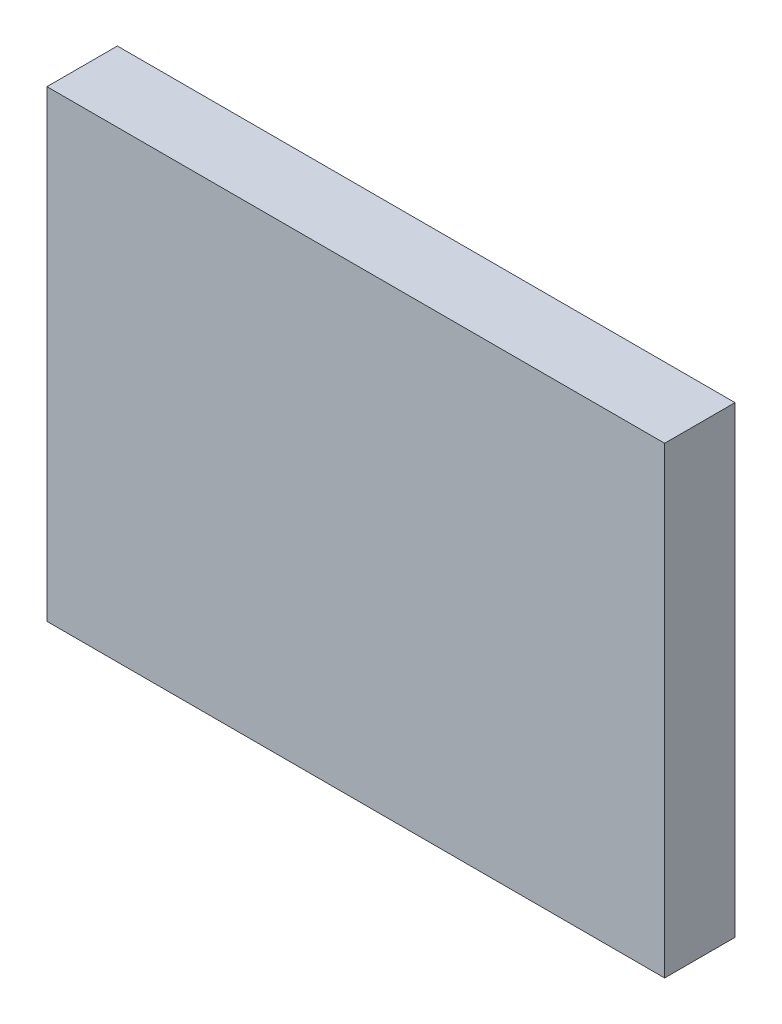
ISO-10303-21;
HEADER;
FILE_DESCRIPTION(('STEP AP214'),'2;1');
FILE_NAME('part.step','',(''),(''),'','','');
FILE_SCHEMA(('AUTOMOTIVE_DESIGN { 1 0 10303 214 1 1 1 1 }'));
ENDSEC;
DATA;
#1=APPLICATION_CONTEXT('core data for automotive mechanical design processes');
#2=APPLICATION_PROTOCOL_DEFINITION('international standard','automotive_design',2000,#1);
#3=PRODUCT_CONTEXT('',#1,'mechanical');
#4=PRODUCT('Part','Part','',(#3));
#5=PRODUCT_RELATED_PRODUCT_CATEGORY('part','',(#4));
#6=PRODUCT_DEFINITION_FORMATION('','',#4);
#7=PRODUCT_DEFINITION_CONTEXT('part definition',#1,'design');
#8=PRODUCT_DEFINITION('design','',#6,#7);
#9=PRODUCT_DEFINITION_SHAPE('','',#8);
#10=(LENGTH_UNIT() NAMED_UNIT(*) SI_UNIT(.MILLI.,.METRE.));
#11=(NAMED_UNIT(*) PLANE_ANGLE_UNIT() SI_UNIT($,.RADIAN.));
#12=(NAMED_UNIT(*) SI_UNIT($,.STERADIAN.) SOLID_ANGLE_UNIT());
#13=UNCERTAINTY_MEASURE_WITH_UNIT(LENGTH_MEASURE(1.E-05),#10,'distance_accuracy_value','');
#14=(GEOMETRIC_REPRESENTATION_CONTEXT(3) GLOBAL_UNCERTAINTY_ASSIGNED_CONTEXT((#13)) GLOBAL_UNIT_ASSIGNED_CONTEXT((#10,
#11,#12)) REPRESENTATION_CONTEXT('',''));
#15=CARTESIAN_POINT('',(0.,0.,0.));
#16=DIRECTION('',(0.,0.,1.));
#17=DIRECTION('',(1.,0.,0.));
#18=AXIS2_PLACEMENT_3D('',#15,#16,#17);
#19=CARTESIAN_POINT('',(0.,2999.,0.));
#20=DIRECTION('',(1.,0.,0.));
#21=DIRECTION('',(0.,0.,-1.));
#22=AXIS2_PLACEMENT_3D('',#19,#20,#21);
#23=PLANE('',#22);
#24=DIRECTION('',(0.,0.,1.));
#25=VECTOR('',#24,1.);
#26=CARTESIAN_POINT('',(0.,0.,0.));
#27=LINE('',#26,#25);
#28=CARTESIAN_POINT('',(0.,0.,-455.932560115936));
#29=VERTEX_POINT('',#28);
#30=CARTESIAN_POINT('',(0.,0.,0.));
#31=VERTEX_POINT('',#30);
#32=EDGE_CURVE('E96',#29,#31,#27,.T.);
#33=ORIENTED_EDGE('',*,*,#32,.T.);
#34=DIRECTION('',(0.,-1.,0.));
#35=VECTOR('',#34,1.);
#36=CARTESIAN_POINT('',(0.,2999.,0.));
#37=LINE('',#36,#35);
#38=CARTESIAN_POINT('',(0.,2999.,0.));
#39=VERTEX_POINT('',#38);
#40=EDGE_CURVE('E11',#39,#31,#37,.T.);
#41=ORIENTED_EDGE('',*,*,#40,.F.);
#42=DIRECTION('',(0.,0.,1.));
#43=VECTOR('',#42,1.);
#44=CARTESIAN_POINT('',(0.,2999.,0.));
#45=LINE('',#44,#43);
#46=CARTESIAN_POINT('',(0.,2999.,-455.932560115936));
#47=VERTEX_POINT('',#46);
#48=EDGE_CURVE('E84',#47,#39,#45,.T.);
#49=ORIENTED_EDGE('',*,*,#48,.F.);
#50=DIRECTION('',(0.,-1.,0.));
#51=VECTOR('',#50,1.);
#52=CARTESIAN_POINT('',(0.,2999.,-455.932560115936));
#53=LINE('',#52,#51);
#54=EDGE_CURVE('E92',#47,#29,#53,.T.);
#55=ORIENTED_EDGE('',*,*,#54,.T.);
#56=EDGE_LOOP('',(#33,#41,#49,#55));
#57=FACE_BOUND('',#56,.T.);
#58=ADVANCED_FACE('F33',(#57),#23,.F.);
#59=CARTESIAN_POINT('',(0.,2999.,0.));
#60=DIRECTION('',(0.,0.,-1.));
#61=DIRECTION('',(-1.,0.,0.));
#62=AXIS2_PLACEMENT_3D('',#59,#60,#61);
#63=PLANE('',#62);
#64=DIRECTION('',(1.,0.,0.));
#65=VECTOR('',#64,1.);
#66=CARTESIAN_POINT('',(0.,0.,0.));
#67=LINE('',#66,#65);
#68=CARTESIAN_POINT('',(4000.,0.,0.));
#69=VERTEX_POINT('',#68);
#70=EDGE_CURVE('E88',#31,#69,#67,.T.);
#71=ORIENTED_EDGE('',*,*,#70,.T.);
#72=DIRECTION('',(0.,-1.,0.));
#73=VECTOR('',#72,1.);
#74=CARTESIAN_POINT('',(4000.,2999.,0.));
#75=LINE('',#74,#73);
#76=CARTESIAN_POINT('',(4000.,2999.,0.));
#77=VERTEX_POINT('',#76);
#78=EDGE_CURVE('E41',#77,#69,#75,.T.);
#79=ORIENTED_EDGE('',*,*,#78,.F.);
#80=DIRECTION('',(1.,0.,0.));
#81=VECTOR('',#80,1.);
#82=CARTESIAN_POINT('',(0.,2999.,0.));
#83=LINE('',#82,#81);
#84=EDGE_CURVE('E79',#39,#77,#83,.T.);
#85=ORIENTED_EDGE('',*,*,#84,.F.);
#86=ORIENTED_EDGE('',*,*,#40,.T.);
#87=EDGE_LOOP('',(#71,#79,#85,#86));
#88=FACE_BOUND('',#87,.T.);
#89=ADVANCED_FACE('F87',(#88),#63,.F.);
#90=CARTESIAN_POINT('',(4000.,2999.,0.));
#91=DIRECTION('',(-1.,0.,0.));
#92=DIRECTION('',(0.,0.,1.));
#93=AXIS2_PLACEMENT_3D('',#90,#91,#92);
#94=PLANE('',#93);
#95=DIRECTION('',(0.,0.,-1.));
#96=VECTOR('',#95,1.);
#97=CARTESIAN_POINT('',(4000.,0.,0.));
#98=LINE('',#97,#96);
#99=CARTESIAN_POINT('',(4000.,0.,-455.932560115936));
#100=VERTEX_POINT('',#99);
#101=EDGE_CURVE('E66',#69,#100,#98,.T.);
#102=ORIENTED_EDGE('',*,*,#101,.T.);
#103=DIRECTION('',(0.,-1.,0.));
#104=VECTOR('',#103,1.);
#105=CARTESIAN_POINT('',(4000.,2999.,-455.932560115936));
#106=LINE('',#105,#104);
#107=CARTESIAN_POINT('',(4000.,2999.,-455.932560115936));
#108=VERTEX_POINT('',#107);
#109=EDGE_CURVE('E89',#108,#100,#106,.T.);
#110=ORIENTED_EDGE('',*,*,#109,.F.);
#111=DIRECTION('',(0.,0.,-1.));
#112=VECTOR('',#111,1.);
#113=CARTESIAN_POINT('',(4000.,2999.,0.));
#114=LINE('',#113,#112);
#115=EDGE_CURVE('E82',#77,#108,#114,.T.);
#116=ORIENTED_EDGE('',*,*,#115,.F.);
#117=ORIENTED_EDGE('',*,*,#78,.T.);
#118=EDGE_LOOP('',(#102,#110,#116,#117));
#119=FACE_BOUND('',#118,.T.);
#120=ADVANCED_FACE('F90',(#119),#94,.F.);
#121=CARTESIAN_POINT('',(0.,2999.,-455.932560115936));
#122=DIRECTION('',(0.,0.,1.));
#123=DIRECTION('',(1.,0.,0.));
#124=AXIS2_PLACEMENT_3D('',#121,#122,#123);
#125=PLANE('',#124);
#126=DIRECTION('',(-1.,0.,0.));
#127=VECTOR('',#126,1.);
#128=CARTESIAN_POINT('',(0.,0.,-455.932560115936));
#129=LINE('',#128,#127);
#130=EDGE_CURVE('E72',#100,#29,#129,.T.);
#131=ORIENTED_EDGE('',*,*,#130,.T.);
#132=ORIENTED_EDGE('',*,*,#54,.F.);
#133=DIRECTION('',(-1.,0.,0.));
#134=VECTOR('',#133,1.);
#135=CARTESIAN_POINT('',(0.,2999.,-455.932560115936));
#136=LINE('',#135,#134);
#137=EDGE_CURVE('E49',#108,#47,#136,.T.);
#138=ORIENTED_EDGE('',*,*,#137,.F.);
#139=ORIENTED_EDGE('',*,*,#109,.T.);
#140=EDGE_LOOP('',(#131,#132,#138,#139));
#141=FACE_BOUND('',#140,.T.);
#142=ADVANCED_FACE('F103',(#141),#125,.F.);
#143=CARTESIAN_POINT('',(0.,2999.,0.));
#144=DIRECTION('',(0.,-1.,0.));
#145=DIRECTION('',(0.,0.,-1.));
#146=AXIS2_PLACEMENT_3D('',#143,#144,#145);
#147=PLANE('',#146);
#148=ORIENTED_EDGE('',*,*,#48,.T.);
#149=ORIENTED_EDGE('',*,*,#84,.T.);
#150=ORIENTED_EDGE('',*,*,#115,.T.);
#151=ORIENTED_EDGE('',*,*,#137,.T.);
#152=EDGE_LOOP('',(#148,#149,#150,#151));
#153=FACE_BOUND('',#152,.T.);
#154=ADVANCED_FACE('F80',(#153),#147,.F.);
#155=CARTESIAN_POINT('',(0.,0.,0.));
#156=DIRECTION('',(0.,-1.,0.));
#157=DIRECTION('',(0.,0.,-1.));
#158=AXIS2_PLACEMENT_3D('',#155,#156,#157);
#159=PLANE('',#158);
#160=ORIENTED_EDGE('',*,*,#32,.F.);
#161=ORIENTED_EDGE('',*,*,#130,.F.);
#162=ORIENTED_EDGE('',*,*,#101,.F.);
#163=ORIENTED_EDGE('',*,*,#70,.F.);
#164=EDGE_LOOP('',(#160,#161,#162,#163));
#165=FACE_BOUND('',#164,.T.);
#166=ADVANCED_FACE('F106',(#165),#159,.T.);
#167=CLOSED_SHELL('',(#58,#89,#120,#142,#154,#166));
#168=MANIFOLD_SOLID_BREP('B2',#167);
#169=ADVANCED_BREP_SHAPE_REPRESENTATION('',(#18,#168),#14);
#170=SHAPE_DEFINITION_REPRESENTATION(#9,#169);
ENDSEC;
END-ISO-10303-21;
